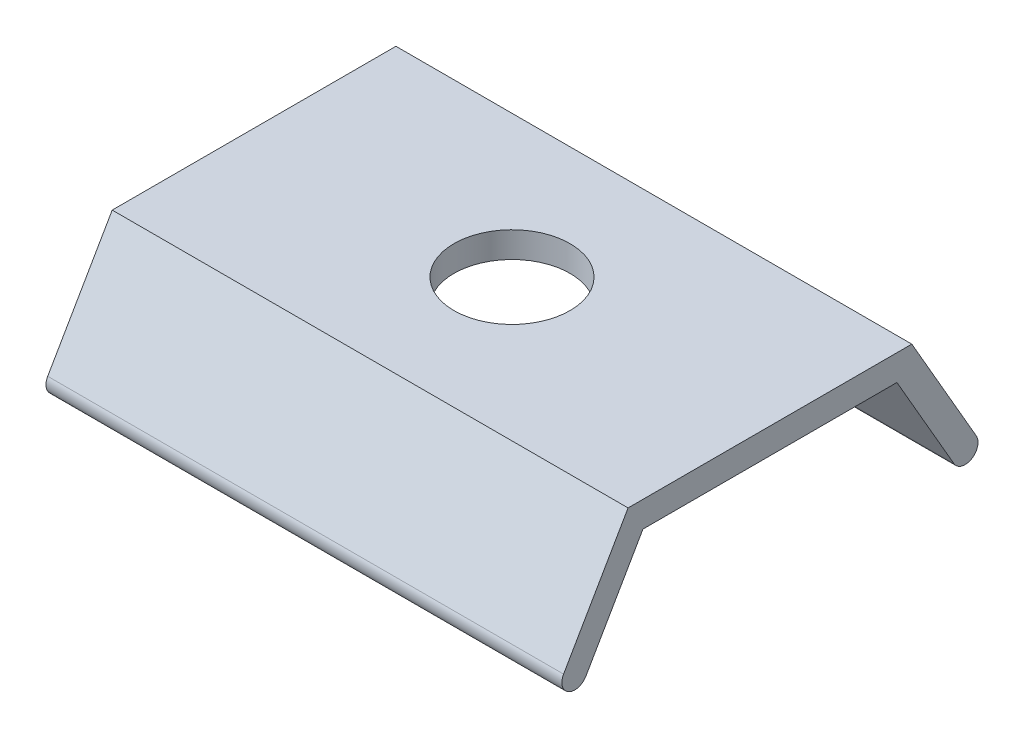
ISO-10303-21;
HEADER;
FILE_DESCRIPTION(('STEP AP214'),'2;1');
FILE_NAME('part.step','',(''),(''),'','','');
FILE_SCHEMA(('AUTOMOTIVE_DESIGN { 1 0 10303 214 1 1 1 1 }'));
ENDSEC;
DATA;
#1=APPLICATION_CONTEXT('core data for automotive mechanical design processes');
#2=APPLICATION_PROTOCOL_DEFINITION('international standard','automotive_design',2000,#1);
#3=PRODUCT_CONTEXT('',#1,'mechanical');
#4=PRODUCT('Part','Part','',(#3));
#5=PRODUCT_RELATED_PRODUCT_CATEGORY('part','',(#4));
#6=PRODUCT_DEFINITION_FORMATION('','',#4);
#7=PRODUCT_DEFINITION_CONTEXT('part definition',#1,'design');
#8=PRODUCT_DEFINITION('design','',#6,#7);
#9=PRODUCT_DEFINITION_SHAPE('','',#8);
#10=(LENGTH_UNIT() NAMED_UNIT(*) SI_UNIT(.MILLI.,.METRE.));
#11=(NAMED_UNIT(*) PLANE_ANGLE_UNIT() SI_UNIT($,.RADIAN.));
#12=(NAMED_UNIT(*) SI_UNIT($,.STERADIAN.) SOLID_ANGLE_UNIT());
#13=UNCERTAINTY_MEASURE_WITH_UNIT(LENGTH_MEASURE(1.E-05),#10,'distance_accuracy_value','');
#14=(GEOMETRIC_REPRESENTATION_CONTEXT(3) GLOBAL_UNCERTAINTY_ASSIGNED_CONTEXT((#13)) GLOBAL_UNIT_ASSIGNED_CONTEXT((#10,
#11,#12)) REPRESENTATION_CONTEXT('',''));
#15=CARTESIAN_POINT('',(0.,0.,0.));
#16=DIRECTION('',(0.,0.,1.));
#17=DIRECTION('',(1.,0.,0.));
#18=AXIS2_PLACEMENT_3D('',#15,#16,#17);
#19=CARTESIAN_POINT('',(10.,-4.5801270189222,-7.56698729810777));
#20=DIRECTION('',(-1.,0.,0.));
#21=DIRECTION('',(0.,0.,1.));
#22=AXIS2_PLACEMENT_3D('',#19,#20,#21);
#23=CYLINDRICAL_SURFACE('',#22,0.499999999999994);
#24=CARTESIAN_POINT('',(-10.,-4.5801270189222,-7.56698729810777));
#25=DIRECTION('',(1.,0.,0.));
#26=DIRECTION('',(0.,0.,1.));
#27=AXIS2_PLACEMENT_3D('',#24,#25,#26);
#28=CIRCLE('',#27,0.499999999999994);
#29=CARTESIAN_POINT('',(-10.,-4.83012701892219,-7.13397459621556));
#30=VERTEX_POINT('',#29);
#31=CARTESIAN_POINT('',(-10.,-4.3301270189222,-7.99999999999998));
#32=VERTEX_POINT('',#31);
#33=EDGE_CURVE('E136',#30,#32,#28,.T.);
#34=ORIENTED_EDGE('',*,*,#33,.T.);
#35=DIRECTION('',(-1.,0.,0.));
#36=VECTOR('',#35,1.);
#37=CARTESIAN_POINT('',(10.,-4.3301270189222,-7.99999999999998));
#38=LINE('',#37,#36);
#39=CARTESIAN_POINT('',(10.,-4.3301270189222,-7.99999999999998));
#40=VERTEX_POINT('',#39);
#41=EDGE_CURVE('E11',#40,#32,#38,.T.);
#42=ORIENTED_EDGE('',*,*,#41,.F.);
#43=CARTESIAN_POINT('',(10.,-4.5801270189222,-7.56698729810777));
#44=DIRECTION('',(1.,0.,0.));
#45=DIRECTION('',(0.,0.,1.));
#46=AXIS2_PLACEMENT_3D('',#43,#44,#45);
#47=CIRCLE('',#46,0.499999999999994);
#48=CARTESIAN_POINT('',(10.,-4.83012701892219,-7.13397459621556));
#49=VERTEX_POINT('',#48);
#50=EDGE_CURVE('E150',#49,#40,#47,.T.);
#51=ORIENTED_EDGE('',*,*,#50,.F.);
#52=DIRECTION('',(-1.,0.,0.));
#53=VECTOR('',#52,1.);
#54=CARTESIAN_POINT('',(10.,-4.83012701892219,-7.13397459621556));
#55=LINE('',#54,#53);
#56=EDGE_CURVE('E132',#49,#30,#55,.T.);
#57=ORIENTED_EDGE('',*,*,#56,.T.);
#58=EDGE_LOOP('',(#34,#42,#51,#57));
#59=FACE_BOUND('',#58,.T.);
#60=ADVANCED_FACE('F39',(#59),#23,.T.);
#61=CARTESIAN_POINT('',(10.,0.,-5.49999999999999));
#62=DIRECTION('',(0.,-0.499999999999998,0.86602540378444));
#63=DIRECTION('',(0.,-0.86602540378444,-0.499999999999998));
#64=AXIS2_PLACEMENT_3D('',#61,#62,#63);
#65=PLANE('',#64);
#66=DIRECTION('',(0.,0.86602540378444,0.499999999999998));
#67=VECTOR('',#66,1.);
#68=CARTESIAN_POINT('',(-10.,0.,-5.49999999999999));
#69=LINE('',#68,#67);
#70=CARTESIAN_POINT('',(-10.,0.,-5.49999999999999));
#71=VERTEX_POINT('',#70);
#72=EDGE_CURVE('E139',#32,#71,#69,.T.);
#73=ORIENTED_EDGE('',*,*,#72,.T.);
#74=DIRECTION('',(-1.,0.,0.));
#75=VECTOR('',#74,1.);
#76=CARTESIAN_POINT('',(10.,0.,-5.49999999999999));
#77=LINE('',#76,#75);
#78=CARTESIAN_POINT('',(10.,0.,-5.49999999999999));
#79=VERTEX_POINT('',#78);
#80=EDGE_CURVE('E48',#79,#71,#77,.T.);
#81=ORIENTED_EDGE('',*,*,#80,.F.);
#82=DIRECTION('',(0.,0.86602540378444,0.499999999999998));
#83=VECTOR('',#82,1.);
#84=CARTESIAN_POINT('',(10.,0.,-5.49999999999999));
#85=LINE('',#84,#83);
#86=EDGE_CURVE('E99',#40,#79,#85,.T.);
#87=ORIENTED_EDGE('',*,*,#86,.F.);
#88=ORIENTED_EDGE('',*,*,#41,.T.);
#89=EDGE_LOOP('',(#73,#81,#87,#88));
#90=FACE_BOUND('',#89,.T.);
#91=ADVANCED_FACE('F202',(#90),#65,.F.);
#92=CARTESIAN_POINT('',(10.,0.,5.49999999999999));
#93=DIRECTION('',(0.,-1.,0.));
#94=DIRECTION('',(0.,0.,-1.));
#95=AXIS2_PLACEMENT_3D('',#92,#93,#94);
#96=PLANE('',#95);
#97=CARTESIAN_POINT('',(0.,0.,0.));
#98=DIRECTION('',(0.,1.,0.));
#99=DIRECTION('',(0.,0.,1.));
#100=AXIS2_PLACEMENT_3D('',#97,#98,#99);
#101=CIRCLE('',#100,2.25);
#102=CARTESIAN_POINT('',(0.,0.,2.25));
#103=VERTEX_POINT('',#102);
#104=EDGE_CURVE('E184',#103,#103,#101,.T.);
#105=ORIENTED_EDGE('',*,*,#104,.F.);
#106=EDGE_LOOP('',(#105));
#107=FACE_BOUND('',#106,.T.);
#108=DIRECTION('',(0.,0.,1.));
#109=VECTOR('',#108,1.);
#110=CARTESIAN_POINT('',(-10.,0.,5.49999999999999));
#111=LINE('',#110,#109);
#112=CARTESIAN_POINT('',(-10.,0.,5.49999999999999));
#113=VERTEX_POINT('',#112);
#114=EDGE_CURVE('E141',#71,#113,#111,.T.);
#115=ORIENTED_EDGE('',*,*,#114,.T.);
#116=DIRECTION('',(-1.,0.,0.));
#117=VECTOR('',#116,1.);
#118=CARTESIAN_POINT('',(10.,0.,5.49999999999999));
#119=LINE('',#118,#117);
#120=CARTESIAN_POINT('',(10.,0.,5.49999999999999));
#121=VERTEX_POINT('',#120);
#122=EDGE_CURVE('E157',#121,#113,#119,.T.);
#123=ORIENTED_EDGE('',*,*,#122,.F.);
#124=DIRECTION('',(0.,0.,1.));
#125=VECTOR('',#124,1.);
#126=CARTESIAN_POINT('',(10.,0.,5.49999999999999));
#127=LINE('',#126,#125);
#128=EDGE_CURVE('E166',#79,#121,#127,.T.);
#129=ORIENTED_EDGE('',*,*,#128,.F.);
#130=ORIENTED_EDGE('',*,*,#80,.T.);
#131=EDGE_LOOP('',(#115,#123,#129,#130));
#132=FACE_BOUND('',#131,.T.);
#133=ADVANCED_FACE('F164',(#107,#132),#96,.F.);
#134=CARTESIAN_POINT('',(10.,0.,5.49999999999999));
#135=DIRECTION('',(0.,-0.500000000000004,-0.866025403784436));
#136=DIRECTION('',(0.,0.866025403784436,-0.500000000000004));
#137=AXIS2_PLACEMENT_3D('',#134,#135,#136);
#138=PLANE('',#137);
#139=DIRECTION('',(0.,-0.866025403784436,0.500000000000004));
#140=VECTOR('',#139,1.);
#141=CARTESIAN_POINT('',(-10.,0.,5.49999999999999));
#142=LINE('',#141,#140);
#143=CARTESIAN_POINT('',(-10.,-4.33012701892218,8.00000000000001));
#144=VERTEX_POINT('',#143);
#145=EDGE_CURVE('E143',#113,#144,#142,.T.);
#146=ORIENTED_EDGE('',*,*,#145,.T.);
#147=DIRECTION('',(-1.,0.,0.));
#148=VECTOR('',#147,1.);
#149=CARTESIAN_POINT('',(10.,-4.33012701892218,8.00000000000001));
#150=LINE('',#149,#148);
#151=CARTESIAN_POINT('',(10.,-4.33012701892218,8.00000000000001));
#152=VERTEX_POINT('',#151);
#153=EDGE_CURVE('E154',#152,#144,#150,.T.);
#154=ORIENTED_EDGE('',*,*,#153,.F.);
#155=DIRECTION('',(0.,-0.866025403784436,0.500000000000004));
#156=VECTOR('',#155,1.);
#157=CARTESIAN_POINT('',(10.,0.,5.49999999999999));
#158=LINE('',#157,#156);
#159=EDGE_CURVE('E178',#121,#152,#158,.T.);
#160=ORIENTED_EDGE('',*,*,#159,.F.);
#161=ORIENTED_EDGE('',*,*,#122,.T.);
#162=EDGE_LOOP('',(#146,#154,#160,#161));
#163=FACE_BOUND('',#162,.T.);
#164=ADVANCED_FACE('F174',(#163),#138,.F.);
#165=CARTESIAN_POINT('',(10.,-4.58012701892219,7.56698729810779));
#166=DIRECTION('',(-1.,0.,0.));
#167=DIRECTION('',(0.,0.,1.));
#168=AXIS2_PLACEMENT_3D('',#165,#166,#167);
#169=CYLINDRICAL_SURFACE('',#168,0.500000000000011);
#170=CARTESIAN_POINT('',(-10.,-4.58012701892219,7.56698729810779));
#171=DIRECTION('',(1.,0.,0.));
#172=DIRECTION('',(0.,0.,-1.));
#173=AXIS2_PLACEMENT_3D('',#170,#171,#172);
#174=CIRCLE('',#173,0.500000000000011);
#175=CARTESIAN_POINT('',(-10.,-4.83012701892219,7.13397459621556));
#176=VERTEX_POINT('',#175);
#177=EDGE_CURVE('E145',#144,#176,#174,.T.);
#178=ORIENTED_EDGE('',*,*,#177,.T.);
#179=DIRECTION('',(-1.,0.,0.));
#180=VECTOR('',#179,1.);
#181=CARTESIAN_POINT('',(10.,-4.83012701892219,7.13397459621556));
#182=LINE('',#181,#180);
#183=CARTESIAN_POINT('',(10.,-4.83012701892219,7.13397459621556));
#184=VERTEX_POINT('',#183);
#185=EDGE_CURVE('E127',#184,#176,#182,.T.);
#186=ORIENTED_EDGE('',*,*,#185,.F.);
#187=CARTESIAN_POINT('',(10.,-4.58012701892219,7.56698729810779));
#188=DIRECTION('',(1.,0.,0.));
#189=DIRECTION('',(0.,0.,-1.));
#190=AXIS2_PLACEMENT_3D('',#187,#188,#189);
#191=CIRCLE('',#190,0.500000000000011);
#192=EDGE_CURVE('E118',#152,#184,#191,.T.);
#193=ORIENTED_EDGE('',*,*,#192,.F.);
#194=ORIENTED_EDGE('',*,*,#153,.T.);
#195=EDGE_LOOP('',(#178,#186,#193,#194));
#196=FACE_BOUND('',#195,.T.);
#197=ADVANCED_FACE('F177',(#196),#169,.T.);
#198=CARTESIAN_POINT('',(10.,-1.,4.92264973081037));
#199=DIRECTION('',(0.,0.5,0.866025403784439));
#200=DIRECTION('',(0.,-0.866025403784439,0.5));
#201=AXIS2_PLACEMENT_3D('',#198,#199,#200);
#202=PLANE('',#201);
#203=DIRECTION('',(0.,0.866025403784439,-0.5));
#204=VECTOR('',#203,1.);
#205=CARTESIAN_POINT('',(-10.,-1.,4.92264973081037));
#206=LINE('',#205,#204);
#207=CARTESIAN_POINT('',(-10.,-1.,4.92264973081037));
#208=VERTEX_POINT('',#207);
#209=EDGE_CURVE('E126',#176,#208,#206,.T.);
#210=ORIENTED_EDGE('',*,*,#209,.T.);
#211=DIRECTION('',(-1.,0.,0.));
#212=VECTOR('',#211,1.);
#213=CARTESIAN_POINT('',(10.,-1.,4.92264973081037));
#214=LINE('',#213,#212);
#215=CARTESIAN_POINT('',(10.,-1.,4.92264973081037));
#216=VERTEX_POINT('',#215);
#217=EDGE_CURVE('E123',#216,#208,#214,.T.);
#218=ORIENTED_EDGE('',*,*,#217,.F.);
#219=DIRECTION('',(0.,0.866025403784439,-0.5));
#220=VECTOR('',#219,1.);
#221=CARTESIAN_POINT('',(10.,-1.,4.92264973081037));
#222=LINE('',#221,#220);
#223=EDGE_CURVE('E112',#184,#216,#222,.T.);
#224=ORIENTED_EDGE('',*,*,#223,.F.);
#225=ORIENTED_EDGE('',*,*,#185,.T.);
#226=EDGE_LOOP('',(#210,#218,#224,#225));
#227=FACE_BOUND('',#226,.T.);
#228=ADVANCED_FACE('F124',(#227),#202,.F.);
#229=CARTESIAN_POINT('',(10.,-1.,4.92264973081037));
#230=DIRECTION('',(0.,1.,0.));
#231=DIRECTION('',(0.,0.,1.));
#232=AXIS2_PLACEMENT_3D('',#229,#230,#231);
#233=PLANE('',#232);
#234=CARTESIAN_POINT('',(0.,-1.,0.));
#235=DIRECTION('',(0.,1.,0.));
#236=DIRECTION('',(0.,0.,1.));
#237=AXIS2_PLACEMENT_3D('',#234,#235,#236);
#238=CIRCLE('',#237,2.25);
#239=CARTESIAN_POINT('',(0.,-1.,2.25));
#240=VERTEX_POINT('',#239);
#241=EDGE_CURVE('E42',#240,#240,#238,.T.);
#242=ORIENTED_EDGE('',*,*,#241,.T.);
#243=EDGE_LOOP('',(#242));
#244=FACE_BOUND('',#243,.T.);
#245=DIRECTION('',(0.,0.,-1.));
#246=VECTOR('',#245,1.);
#247=CARTESIAN_POINT('',(-10.,-1.,4.92264973081037));
#248=LINE('',#247,#246);
#249=CARTESIAN_POINT('',(-10.,-1.,-4.92264973081037));
#250=VERTEX_POINT('',#249);
#251=EDGE_CURVE('E85',#208,#250,#248,.T.);
#252=ORIENTED_EDGE('',*,*,#251,.T.);
#253=DIRECTION('',(-1.,0.,0.));
#254=VECTOR('',#253,1.);
#255=CARTESIAN_POINT('',(10.,-1.,-4.92264973081037));
#256=LINE('',#255,#254);
#257=CARTESIAN_POINT('',(10.,-1.,-4.92264973081037));
#258=VERTEX_POINT('',#257);
#259=EDGE_CURVE('E128',#258,#250,#256,.T.);
#260=ORIENTED_EDGE('',*,*,#259,.F.);
#261=DIRECTION('',(0.,0.,-1.));
#262=VECTOR('',#261,1.);
#263=CARTESIAN_POINT('',(10.,-1.,4.92264973081037));
#264=LINE('',#263,#262);
#265=EDGE_CURVE('E116',#216,#258,#264,.T.);
#266=ORIENTED_EDGE('',*,*,#265,.F.);
#267=ORIENTED_EDGE('',*,*,#217,.T.);
#268=EDGE_LOOP('',(#252,#260,#266,#267));
#269=FACE_BOUND('',#268,.T.);
#270=ADVANCED_FACE('F130',(#244,#269),#233,.F.);
#271=CARTESIAN_POINT('',(10.,-1.,-4.92264973081037));
#272=DIRECTION('',(0.,0.5,-0.866025403784439));
#273=DIRECTION('',(0.,0.866025403784439,0.5));
#274=AXIS2_PLACEMENT_3D('',#271,#272,#273);
#275=PLANE('',#274);
#276=DIRECTION('',(0.,-0.866025403784439,-0.5));
#277=VECTOR('',#276,1.);
#278=CARTESIAN_POINT('',(-10.,-1.,-4.92264973081037));
#279=LINE('',#278,#277);
#280=EDGE_CURVE('E91',#250,#30,#279,.T.);
#281=ORIENTED_EDGE('',*,*,#280,.T.);
#282=ORIENTED_EDGE('',*,*,#56,.F.);
#283=DIRECTION('',(0.,-0.866025403784439,-0.5));
#284=VECTOR('',#283,1.);
#285=CARTESIAN_POINT('',(10.,-1.,-4.92264973081037));
#286=LINE('',#285,#284);
#287=EDGE_CURVE('E56',#258,#49,#286,.T.);
#288=ORIENTED_EDGE('',*,*,#287,.F.);
#289=ORIENTED_EDGE('',*,*,#259,.T.);
#290=EDGE_LOOP('',(#281,#282,#288,#289));
#291=FACE_BOUND('',#290,.T.);
#292=ADVANCED_FACE('F209',(#291),#275,.F.);
#293=CARTESIAN_POINT('',(10.,-4.5801270189222,-7.56698729810777));
#294=DIRECTION('',(-1.,0.,0.));
#295=DIRECTION('',(0.,0.,1.));
#296=AXIS2_PLACEMENT_3D('',#293,#294,#295);
#297=PLANE('',#296);
#298=ORIENTED_EDGE('',*,*,#50,.T.);
#299=ORIENTED_EDGE('',*,*,#86,.T.);
#300=ORIENTED_EDGE('',*,*,#128,.T.);
#301=ORIENTED_EDGE('',*,*,#159,.T.);
#302=ORIENTED_EDGE('',*,*,#192,.T.);
#303=ORIENTED_EDGE('',*,*,#223,.T.);
#304=ORIENTED_EDGE('',*,*,#265,.T.);
#305=ORIENTED_EDGE('',*,*,#287,.T.);
#306=EDGE_LOOP('',(#298,#299,#300,#301,#302,#303,#304,#305));
#307=FACE_BOUND('',#306,.T.);
#308=ADVANCED_FACE('F114',(#307),#297,.F.);
#309=CARTESIAN_POINT('',(-10.,-4.5801270189222,-7.56698729810777));
#310=DIRECTION('',(-1.,0.,0.));
#311=DIRECTION('',(0.,0.,1.));
#312=AXIS2_PLACEMENT_3D('',#309,#310,#311);
#313=PLANE('',#312);
#314=ORIENTED_EDGE('',*,*,#33,.F.);
#315=ORIENTED_EDGE('',*,*,#280,.F.);
#316=ORIENTED_EDGE('',*,*,#251,.F.);
#317=ORIENTED_EDGE('',*,*,#209,.F.);
#318=ORIENTED_EDGE('',*,*,#177,.F.);
#319=ORIENTED_EDGE('',*,*,#145,.F.);
#320=ORIENTED_EDGE('',*,*,#114,.F.);
#321=ORIENTED_EDGE('',*,*,#72,.F.);
#322=EDGE_LOOP('',(#314,#315,#316,#317,#318,#319,#320,#321));
#323=FACE_BOUND('',#322,.T.);
#324=ADVANCED_FACE('F170',(#323),#313,.T.);
#325=CARTESIAN_POINT('',(0.,0.,0.));
#326=DIRECTION('',(0.,1.,0.));
#327=DIRECTION('',(0.,0.,1.));
#328=AXIS2_PLACEMENT_3D('',#325,#326,#327);
#329=CYLINDRICAL_SURFACE('',#328,2.25);
#330=ORIENTED_EDGE('',*,*,#104,.T.);
#331=EDGE_LOOP('',(#330));
#332=FACE_BOUND('',#331,.T.);
#333=ORIENTED_EDGE('',*,*,#241,.F.);
#334=EDGE_LOOP('',(#333));
#335=FACE_BOUND('',#334,.T.);
#336=ADVANCED_FACE('F192',(#332,#335),#329,.F.);
#337=CLOSED_SHELL('',(#60,#91,#133,#164,#197,#228,#270,#292,#308,#324,#336));
#338=MANIFOLD_SOLID_BREP('B2',#337);
#339=ADVANCED_BREP_SHAPE_REPRESENTATION('',(#18,#338),#14);
#340=SHAPE_DEFINITION_REPRESENTATION(#9,#339);
ENDSEC;
END-ISO-10303-21;
